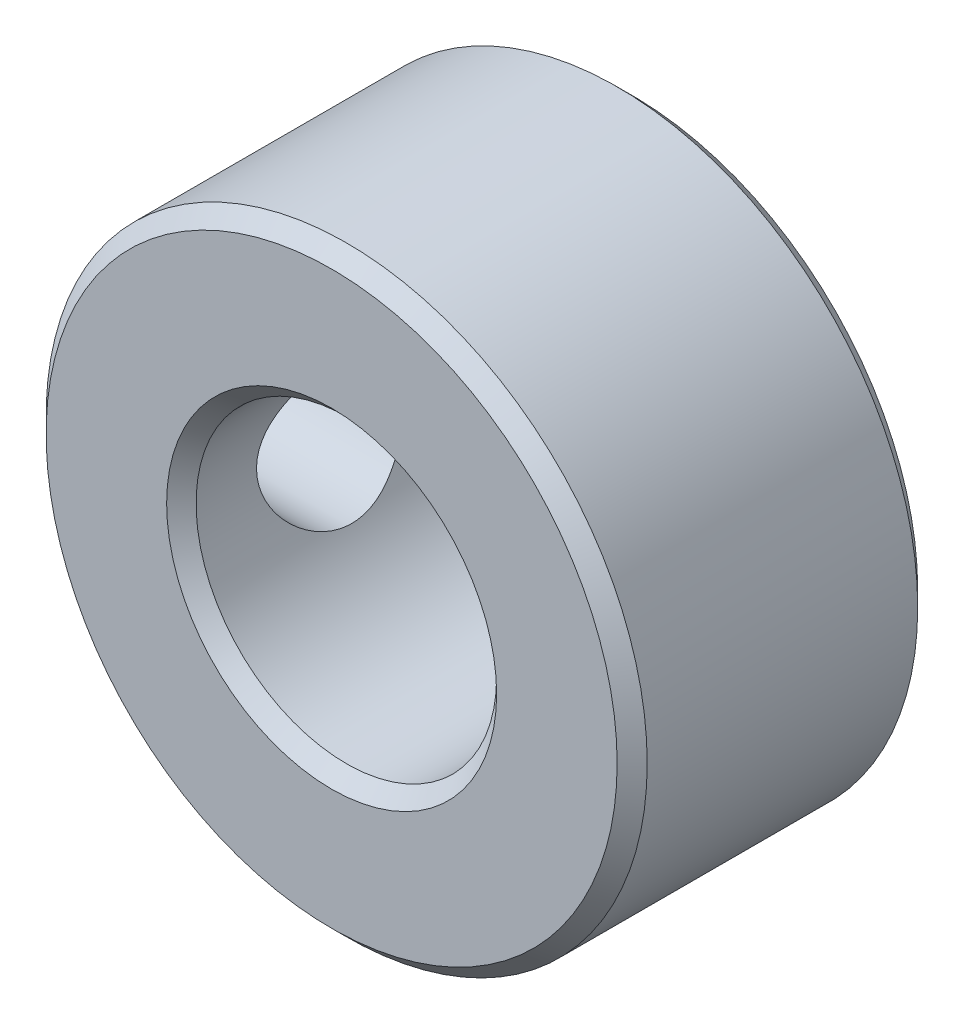
ISO-10303-21;
HEADER;
FILE_DESCRIPTION(('STEP AP214'),'2;1');
FILE_NAME('part.step','',(''),(''),'','','');
FILE_SCHEMA(('AUTOMOTIVE_DESIGN { 1 0 10303 214 1 1 1 1 }'));
ENDSEC;
DATA;
#1=APPLICATION_CONTEXT('core data for automotive mechanical design processes');
#2=APPLICATION_PROTOCOL_DEFINITION('international standard','automotive_design',2000,#1);
#3=PRODUCT_CONTEXT('',#1,'mechanical');
#4=PRODUCT('Part','Part','',(#3));
#5=PRODUCT_RELATED_PRODUCT_CATEGORY('part','',(#4));
#6=PRODUCT_DEFINITION_FORMATION('','',#4);
#7=PRODUCT_DEFINITION_CONTEXT('part definition',#1,'design');
#8=PRODUCT_DEFINITION('design','',#6,#7);
#9=PRODUCT_DEFINITION_SHAPE('','',#8);
#10=(LENGTH_UNIT() NAMED_UNIT(*) SI_UNIT(.MILLI.,.METRE.));
#11=(NAMED_UNIT(*) PLANE_ANGLE_UNIT() SI_UNIT($,.RADIAN.));
#12=(NAMED_UNIT(*) SI_UNIT($,.STERADIAN.) SOLID_ANGLE_UNIT());
#13=UNCERTAINTY_MEASURE_WITH_UNIT(LENGTH_MEASURE(1.E-05),#10,'distance_accuracy_value','');
#14=(GEOMETRIC_REPRESENTATION_CONTEXT(3) GLOBAL_UNCERTAINTY_ASSIGNED_CONTEXT((#13)) GLOBAL_UNIT_ASSIGNED_CONTEXT((#10,
#11,#12)) REPRESENTATION_CONTEXT('',''));
#15=CARTESIAN_POINT('',(0.,0.,0.));
#16=DIRECTION('',(0.,0.,1.));
#17=DIRECTION('',(1.,0.,0.));
#18=AXIS2_PLACEMENT_3D('',#15,#16,#17);
#19=CARTESIAN_POINT('',(33.2499999916199,61.2600000000035,-9.8775));
#20=DIRECTION('',(0.,0.,-1.));
#21=DIRECTION('',(-1.,0.,0.));
#22=AXIS2_PLACEMENT_3D('',#19,#20,#21);
#23=CONICAL_SURFACE('',#22,2.6225,0.785398163397484);
#24=CARTESIAN_POINT('',(33.2499999916199,61.2600000000035,-9.755));
#25=DIRECTION('',(0.,0.,1.));
#26=DIRECTION('',(-1.,0.,0.));
#27=AXIS2_PLACEMENT_3D('',#24,#25,#26);
#28=CIRCLE('',#27,2.5);
#29=CARTESIAN_POINT('',(35.7499999916199,61.2600000000035,-9.755));
#30=VERTEX_POINT('',#29);
#31=EDGE_CURVE('E29',#30,#30,#28,.T.);
#32=ORIENTED_EDGE('',*,*,#31,.T.);
#33=DIRECTION('',(0.707106781186573,0.,-0.707106781186522));
#34=VECTOR('',#33,1.);
#35=CARTESIAN_POINT('',(35.8724999916199,61.2600000000035,-9.8775));
#36=LINE('',#35,#34);
#37=CARTESIAN_POINT('',(35.9949999916199,61.2600000000035,-10.));
#38=VERTEX_POINT('',#37);
#39=EDGE_CURVE('E11',#30,#38,#36,.T.);
#40=ORIENTED_EDGE('',*,*,#39,.T.);
#41=CARTESIAN_POINT('',(33.2499999916199,61.2600000000035,-10.));
#42=DIRECTION('',(0.,0.,-1.));
#43=DIRECTION('',(-1.,0.,0.));
#44=AXIS2_PLACEMENT_3D('',#41,#42,#43);
#45=CIRCLE('',#44,2.745);
#46=EDGE_CURVE('E105',#38,#38,#45,.T.);
#47=ORIENTED_EDGE('',*,*,#46,.T.);
#48=ORIENTED_EDGE('',*,*,#39,.F.);
#49=EDGE_LOOP('',(#32,#40,#47,#48));
#50=FACE_BOUND('',#49,.T.);
#51=ADVANCED_FACE('F17',(#50),#23,.F.);
#52=CARTESIAN_POINT('',(33.2499999916199,61.2600000000035,-10.));
#53=DIRECTION('',(0.,0.,1.));
#54=DIRECTION('',(-1.,0.,0.));
#55=AXIS2_PLACEMENT_3D('',#52,#53,#54);
#56=CYLINDRICAL_SURFACE('',#55,2.5);
#57=CARTESIAN_POINT('',(30.7499999916199,61.2600000000035,-8.75));
#58=CARTESIAN_POINT('',(30.750003574068,61.1942850463123,-8.74999587210066));
#59=CARTESIAN_POINT('',(30.7526188538759,61.128491750381,-8.74478740859791));
#60=CARTESIAN_POINT('',(30.7628230411524,60.998849705918,-8.72418389957383));
#61=CARTESIAN_POINT('',(30.7704213937576,60.9350048916117,-8.70876950875293));
#62=CARTESIAN_POINT('',(30.7897964990785,60.8113330689028,-8.66850773922904));
#63=CARTESIAN_POINT('',(30.8015570019009,60.7514914963295,-8.64369701969004));
#64=CARTESIAN_POINT('',(30.8281777851727,60.6369092289953,-8.5855367232939));
#65=CARTESIAN_POINT('',(30.8430378212008,60.5821681325159,-8.55218781968902));
#66=CARTESIAN_POINT('',(30.8755467633942,60.4756152278011,-8.47560343814347));
#67=CARTESIAN_POINT('',(30.8933100025257,60.4241809861008,-8.43189190095056));
#68=CARTESIAN_POINT('',(30.9292503635356,60.3290256939197,-8.33684815094134));
#69=CARTESIAN_POINT('',(30.947427789007,60.28531052112,-8.2855101852846));
#70=CARTESIAN_POINT('',(30.9837631016531,60.2034349994405,-8.17189581309593));
#71=CARTESIAN_POINT('',(31.0018101544933,60.1659683305638,-8.10907987706777));
#72=CARTESIAN_POINT('',(31.033925256966,60.10228971639,-7.97704083001741));
#73=CARTESIAN_POINT('',(31.0479961465326,60.0760697312954,-7.90782233909675));
#74=CARTESIAN_POINT('',(31.0692766536474,60.0373344472676,-7.76916861822279));
#75=CARTESIAN_POINT('',(31.0768465968236,60.0240926786528,-7.69999443491595));
#76=CARTESIAN_POINT('',(31.0852263672634,60.0094662583672,-7.56002645277584));
#77=CARTESIAN_POINT('',(31.0860428748289,60.0080698895369,-7.48923432391123));
#78=CARTESIAN_POINT('',(31.0811133634044,60.0166408910378,-7.35714246960596));
#79=CARTESIAN_POINT('',(31.0761404458449,60.0252693005822,-7.29571996097136));
#80=CARTESIAN_POINT('',(31.0615471324469,60.0513251886821,-7.17534761328386));
#81=CARTESIAN_POINT('',(31.0519252562228,60.0687554701312,-7.11639856836852));
#82=CARTESIAN_POINT('',(31.0289065364608,60.1122377745207,-7.00096358429308));
#83=CARTESIAN_POINT('',(31.0154269833201,60.1384811661082,-6.94456700151791));
#84=CARTESIAN_POINT('',(30.9862074381025,60.1986978904182,-6.83670713426264));
#85=CARTESIAN_POINT('',(30.9704664318677,60.2326746952376,-6.78524608050005));
#86=CARTESIAN_POINT('',(30.936085517829,60.3124174313622,-6.68184843407112));
#87=CARTESIAN_POINT('',(30.9173311136607,60.3591319270415,-6.63067890802994));
#88=CARTESIAN_POINT('',(30.8806547003649,60.4605555265764,-6.53658072676149));
#89=CARTESIAN_POINT('',(30.862733092135,60.5152684292852,-6.49365600995776));
#90=CARTESIAN_POINT('',(30.828725150583,60.6343543677132,-6.41539292371293));
#91=CARTESIAN_POINT('',(30.8127626895949,60.6990580105038,-6.38049940944289));
#92=CARTESIAN_POINT('',(30.7855264776045,60.834417230642,-6.32237871369628));
#93=CARTESIAN_POINT('',(30.7742490048256,60.9050680296715,-6.29914226873107));
#94=CARTESIAN_POINT('',(30.758445819852,61.0440418854272,-6.26690574535416));
#95=CARTESIAN_POINT('',(30.7534382628535,61.1120730868176,-6.25688595531651));
#96=CARTESIAN_POINT('',(30.7490873233811,61.2490255000664,-6.24816908608184));
#97=CARTESIAN_POINT('',(30.7497412576035,61.3179462748404,-6.24946664295059));
#98=CARTESIAN_POINT('',(30.7563600884519,61.4490412149855,-6.26275836052336));
#99=CARTESIAN_POINT('',(30.7619094205175,61.5113242600655,-6.27391566591244));
#100=CARTESIAN_POINT('',(30.7772228501846,61.6330086153804,-6.30529758986874));
#101=CARTESIAN_POINT('',(30.7869874124406,61.6924096071168,-6.32552320806658));
#102=CARTESIAN_POINT('',(30.8101968489489,61.8086107605651,-6.37499808304133));
#103=CARTESIAN_POINT('',(30.8237389694956,61.8652879962608,-6.40448881264587));
#104=CARTESIAN_POINT('',(30.8532003126559,61.9730767021268,-6.47138441955738));
#105=CARTESIAN_POINT('',(30.8691205470475,62.0241857872222,-6.5087926682416));
#106=CARTESIAN_POINT('',(30.9036472249015,62.1247096116165,-6.59470053166587));
#107=CARTESIAN_POINT('',(30.9223639310142,62.1734650972839,-6.64392858556673));
#108=CARTESIAN_POINT('',(30.9592200965713,62.2623204013947,-6.74990643908639));
#109=CARTESIAN_POINT('',(30.9773591493506,62.3024142321167,-6.80666139852021));
#110=CARTESIAN_POINT('',(31.0118600887939,62.3746348931252,-6.92955456775011));
#111=CARTESIAN_POINT('',(31.0280933708263,62.4062818698515,-6.99601408276045));
#112=CARTESIAN_POINT('',(31.0553240870182,62.4576035325205,-7.13438758461534));
#113=CARTESIAN_POINT('',(31.066328263612,62.4772936448627,-7.20629440812617));
#114=CARTESIAN_POINT('',(31.0804812290114,62.5023271093154,-7.3461377785765));
#115=CARTESIAN_POINT('',(31.0842826983636,62.5088662455043,-7.41379281678599));
#116=CARTESIAN_POINT('',(31.0854330585426,62.5108614429793,-7.54930883396312));
#117=CARTESIAN_POINT('',(31.0827847462754,62.5063223082838,-7.61716971092401));
#118=CARTESIAN_POINT('',(31.0720267159945,62.4874076569937,-7.74435437691475));
#119=CARTESIAN_POINT('',(31.0644613105899,62.4740103929318,-7.80387558768024));
#120=CARTESIAN_POINT('',(31.0453622892709,62.4389691977842,-7.91976014928064));
#121=CARTESIAN_POINT('',(31.0338273969989,62.4173226139531,-7.97612247761473));
#122=CARTESIAN_POINT('',(31.0071433620632,62.3647696816292,-8.08828106373303));
#123=CARTESIAN_POINT('',(30.9918034616675,62.3333389222739,-8.1437848772869));
#124=CARTESIAN_POINT('',(30.9595583461875,62.2626887145492,-8.24909317022552));
#125=CARTESIAN_POINT('',(30.9426523191883,62.2234652140518,-8.29889466314792));
#126=CARTESIAN_POINT('',(30.9067209521285,62.1327541583343,-8.39767747794684));
#127=CARTESIAN_POINT('',(30.8876877002265,62.0803555287662,-8.44582387795221));
#128=CARTESIAN_POINT('',(30.8515280884313,61.9676935077788,-8.53282872927936));
#129=CARTESIAN_POINT('',(30.8344027590194,61.9074259040744,-8.57168217428269));
#130=CARTESIAN_POINT('',(30.8037748718061,61.7799144960284,-8.63904545345261));
#131=CARTESIAN_POINT('',(30.7902987845835,61.7126243799217,-8.66748021176416));
#132=CARTESIAN_POINT('',(30.7687332245766,61.5734276266212,-8.7122602098986));
#133=CARTESIAN_POINT('',(30.7606284494583,61.5015347495324,-8.72863980853689));
#134=CARTESIAN_POINT('',(30.7538067177491,61.4007524331077,-8.74237176384474));
#135=CARTESIAN_POINT('',(30.7523829248799,61.3727023493029,-8.74522830107944));
#136=CARTESIAN_POINT('',(30.7504787793966,61.3164396647624,-8.74904333189596));
#137=CARTESIAN_POINT('',(30.7499984528229,61.2882270595627,-8.75000177308898));
#138=CARTESIAN_POINT('',(30.7499999916199,61.2600000000035,-8.75));
#139=B_SPLINE_CURVE_WITH_KNOTS('',3,(#57,#58,#59,#60,#61,#62,#63,#64,#65,#66,#67,#68,#69,#70,
#71,#72,#73,#74,#75,#76,#77,#78,#79,#80,#81,#82,#83,#84,#85,#86,#87,#88,#89,#90,#91,#92,#93,#94,
#95,#96,#97,#98,#99,#100,#101,#102,#103,#104,#105,#106,#107,#108,#109,#110,#111,#112,#113,#114,
#115,#116,#117,#118,#119,#120,#121,#122,#123,#124,#125,#126,#127,#128,#129,#130,#131,#132,#133,
#134,#135,#136,#137,#138),.UNSPECIFIED.,.T.,.F.,(4,2,2,2,2,2,2,2,2,2,2,2,2,2,2,2,2,2,2,2,2,2,2,
2,2,2,2,2,2,2,2,2,2,2,2,2,2,2,2,2,4),(0.,0.19703032177534,0.394435187136452,0.591077694365336,
0.787704700726923,0.996227198397589,1.20490779706754,1.4297715803844,1.6544743487285,
1.86572515175288,2.07676696661278,2.26257140511653,2.44843504907101,2.63862800210611,
2.82890651575278,3.04331176667347,3.25781918248356,3.48228777768051,3.70657771140351,
3.91229113089185,4.11790705639349,4.30758633132653,4.49728652038665,4.69241070034876,
4.88761813435429,5.10199513305523,5.31651985769285,5.54143352699589,5.76605639925968,
5.96911634372965,6.17208824825007,6.35572412805231,6.53941910979602,6.7354557096952,
6.93159451423697,7.15156553440623,7.37165479220716,7.59330017078657,7.81431135781165,
7.89894100172123,7.98357298143559),.UNSPECIFIED.);
#140=CARTESIAN_POINT('',(31.0849364821587,62.5100000000033,-7.5));
#141=VERTEX_POINT('',#140);
#142=EDGE_CURVE('E128',#141,#141,#139,.T.);
#143=ORIENTED_EDGE('',*,*,#142,.T.);
#144=EDGE_LOOP('',(#143));
#145=FACE_BOUND('',#144,.T.);
#146=CARTESIAN_POINT('',(33.2499999916199,61.2600000000035,-5.24499999999994));
#147=DIRECTION('',(0.,0.,-1.));
#148=DIRECTION('',(-1.,0.,0.));
#149=AXIS2_PLACEMENT_3D('',#146,#147,#148);
#150=CIRCLE('',#149,2.5);
#151=CARTESIAN_POINT('',(35.7499999916199,61.2600000000035,-5.24499999999994));
#152=VERTEX_POINT('',#151);
#153=EDGE_CURVE('E141',#152,#152,#150,.T.);
#154=ORIENTED_EDGE('',*,*,#153,.F.);
#155=DIRECTION('',(0.,0.,-1.));
#156=VECTOR('',#155,1.);
#157=CARTESIAN_POINT('',(35.7499999916199,61.2600000000035,-10.));
#158=LINE('',#157,#156);
#159=EDGE_CURVE('E137',#152,#30,#158,.T.);
#160=ORIENTED_EDGE('',*,*,#159,.T.);
#161=ORIENTED_EDGE('',*,*,#31,.F.);
#162=ORIENTED_EDGE('',*,*,#159,.F.);
#163=EDGE_LOOP('',(#154,#160,#161,#162));
#164=FACE_BOUND('',#163,.T.);
#165=ADVANCED_FACE('F154',(#145,#164),#56,.F.);
#166=CARTESIAN_POINT('',(33.2499999916199,61.2600000000035,-5.12249999999994));
#167=DIRECTION('',(0.,0.,1.));
#168=DIRECTION('',(-1.,0.,0.));
#169=AXIS2_PLACEMENT_3D('',#166,#167,#168);
#170=CONICAL_SURFACE('',#169,2.6225,0.785398163397419);
#171=ORIENTED_EDGE('',*,*,#153,.T.);
#172=DIRECTION('',(0.707106781186527,0.,0.707106781186568));
#173=VECTOR('',#172,1.);
#174=CARTESIAN_POINT('',(35.8724999916199,61.2600000000035,-5.12249999999994));
#175=LINE('',#174,#173);
#176=CARTESIAN_POINT('',(35.9949999916199,61.2600000000035,-4.99999999999994));
#177=VERTEX_POINT('',#176);
#178=EDGE_CURVE('E53',#152,#177,#175,.T.);
#179=ORIENTED_EDGE('',*,*,#178,.T.);
#180=CARTESIAN_POINT('',(33.2499999916199,61.2600000000035,-4.99999999999994));
#181=DIRECTION('',(0.,0.,1.));
#182=DIRECTION('',(-1.,0.,0.));
#183=AXIS2_PLACEMENT_3D('',#180,#181,#182);
#184=CIRCLE('',#183,2.745);
#185=EDGE_CURVE('E135',#177,#177,#184,.T.);
#186=ORIENTED_EDGE('',*,*,#185,.T.);
#187=ORIENTED_EDGE('',*,*,#178,.F.);
#188=EDGE_LOOP('',(#171,#179,#186,#187));
#189=FACE_BOUND('',#188,.T.);
#190=ADVANCED_FACE('F225',(#189),#170,.F.);
#191=CARTESIAN_POINT('',(40.0998250928018,79.6300000000035,-5.));
#192=DIRECTION('',(0.,0.,1.));
#193=DIRECTION('',(0.,-1.,0.));
#194=AXIS2_PLACEMENT_3D('',#191,#192,#193);
#195=PLANE('',#194);
#196=ORIENTED_EDGE('',*,*,#185,.F.);
#197=EDGE_LOOP('',(#196));
#198=FACE_BOUND('',#197,.T.);
#199=CARTESIAN_POINT('',(33.2499999916199,61.2600000000035,-4.99999999999994));
#200=DIRECTION('',(0.,0.,-1.));
#201=DIRECTION('',(-1.,0.,0.));
#202=AXIS2_PLACEMENT_3D('',#199,#200,#201);
#203=CIRCLE('',#202,4.75);
#204=CARTESIAN_POINT('',(37.9999999916199,61.2600000000035,-4.99999999999994));
#205=VERTEX_POINT('',#204);
#206=EDGE_CURVE('E62',#205,#205,#203,.T.);
#207=ORIENTED_EDGE('',*,*,#206,.F.);
#208=EDGE_LOOP('',(#207));
#209=FACE_BOUND('',#208,.T.);
#210=ADVANCED_FACE('F227',(#198,#209),#195,.T.);
#211=CARTESIAN_POINT('',(33.2499999916199,61.2600000000035,-5.125));
#212=DIRECTION('',(0.,0.,-1.));
#213=DIRECTION('',(-1.,0.,0.));
#214=AXIS2_PLACEMENT_3D('',#211,#212,#213);
#215=CONICAL_SURFACE('',#214,4.875,0.785398163397411);
#216=CARTESIAN_POINT('',(33.2499999916199,61.2600000000035,-5.25));
#217=DIRECTION('',(0.,0.,1.));
#218=DIRECTION('',(-1.,0.,0.));
#219=AXIS2_PLACEMENT_3D('',#216,#217,#218);
#220=CIRCLE('',#219,5.);
#221=CARTESIAN_POINT('',(38.2499999916199,61.2600000000035,-5.25));
#222=VERTEX_POINT('',#221);
#223=EDGE_CURVE('E103',#222,#222,#220,.T.);
#224=ORIENTED_EDGE('',*,*,#223,.T.);
#225=DIRECTION('',(-0.707106781186521,0.,0.707106781186574));
#226=VECTOR('',#225,1.);
#227=CARTESIAN_POINT('',(38.1249999916199,61.2600000000035,-5.125));
#228=LINE('',#227,#226);
#229=EDGE_CURVE('E130',#222,#205,#228,.T.);
#230=ORIENTED_EDGE('',*,*,#229,.T.);
#231=ORIENTED_EDGE('',*,*,#206,.T.);
#232=ORIENTED_EDGE('',*,*,#229,.F.);
#233=EDGE_LOOP('',(#224,#230,#231,#232));
#234=FACE_BOUND('',#233,.T.);
#235=ADVANCED_FACE('F230',(#234),#215,.T.);
#236=CARTESIAN_POINT('',(40.0998250928018,79.6300000000035,-10.));
#237=DIRECTION('',(0.,0.,1.));
#238=DIRECTION('',(0.,-1.,0.));
#239=AXIS2_PLACEMENT_3D('',#236,#237,#238);
#240=PLANE('',#239);
#241=ORIENTED_EDGE('',*,*,#46,.F.);
#242=EDGE_LOOP('',(#241));
#243=FACE_BOUND('',#242,.T.);
#244=CARTESIAN_POINT('',(33.2499999916199,61.2600000000035,-10.));
#245=DIRECTION('',(0.,0.,1.));
#246=DIRECTION('',(-1.,0.,0.));
#247=AXIS2_PLACEMENT_3D('',#244,#245,#246);
#248=CIRCLE('',#247,4.75);
#249=CARTESIAN_POINT('',(37.9999999916199,61.2600000000035,-10.));
#250=VERTEX_POINT('',#249);
#251=EDGE_CURVE('E119',#250,#250,#248,.T.);
#252=ORIENTED_EDGE('',*,*,#251,.F.);
#253=EDGE_LOOP('',(#252));
#254=FACE_BOUND('',#253,.T.);
#255=ADVANCED_FACE('F169',(#243,#254),#240,.F.);
#256=CARTESIAN_POINT('',(33.2499999916199,61.2600000000035,-10.));
#257=DIRECTION('',(0.,0.,1.));
#258=DIRECTION('',(-1.,0.,0.));
#259=AXIS2_PLACEMENT_3D('',#256,#257,#258);
#260=CYLINDRICAL_SURFACE('',#259,5.);
#261=CARTESIAN_POINT('',(28.4372474365716,59.9044879772329,-7.49999999999995));
#262=CARTESIAN_POINT('',(28.4372460969126,59.9044939501337,-7.52552764556176));
#263=CARTESIAN_POINT('',(28.4371103853482,59.9049746301144,-7.55105592293867));
#264=CARTESIAN_POINT('',(28.4365698640669,59.9068953192905,-7.6019112406172));
#265=CARTESIAN_POINT('',(28.4361667662633,59.9083292256775,-7.62723853046742));
#266=CARTESIAN_POINT('',(28.4350937391105,59.9121567310729,-7.67769207469152));
#267=CARTESIAN_POINT('',(28.4344251073822,59.9145456633978,-7.70281870930217));
#268=CARTESIAN_POINT('',(28.4328258806578,59.920282685637,-7.7528707026705));
#269=CARTESIAN_POINT('',(28.4318961486175,59.9236276165395,-7.7777964508105));
#270=CARTESIAN_POINT('',(28.4297811079334,59.931276697325,-7.8274467575389));
#271=CARTESIAN_POINT('',(28.4285962293341,59.9355792335879,-7.85217158288945));
#272=CARTESIAN_POINT('',(28.4259788979375,59.9451444739722,-7.90142002189345));
#273=CARTESIAN_POINT('',(28.4245464598302,59.9504071211226,-7.92594364739549));
#274=CARTESIAN_POINT('',(28.4214442404424,59.9618918291932,-7.97479056420655));
#275=CARTESIAN_POINT('',(28.4197740930888,59.9681153711723,-7.99911348414098));
#276=CARTESIAN_POINT('',(28.4162063000167,59.9815295247127,-8.04755716466081));
#277=CARTESIAN_POINT('',(28.4143079518847,59.9887231309064,-8.07167704322212));
#278=CARTESIAN_POINT('',(28.4102747362915,60.0041638537009,-8.12006313377842));
#279=CARTESIAN_POINT('',(28.4081360755848,60.0124283174243,-8.14432349031982));
#280=CARTESIAN_POINT('',(28.4036935527497,60.0297994604868,-8.1922006052162));
#281=CARTESIAN_POINT('',(28.4013919309492,60.0388950838172,-8.21582157774048));
#282=CARTESIAN_POINT('',(28.3966362523097,60.0579369064274,-8.26241754264025));
#283=CARTESIAN_POINT('',(28.3941840050385,60.0678734041915,-8.28539667890604));
#284=CARTESIAN_POINT('',(28.3891432565376,60.0885971949531,-8.33070969219227));
#285=CARTESIAN_POINT('',(28.3865561232053,60.0993763518052,-8.35304743938621));
#286=CARTESIAN_POINT('',(28.3812625536509,60.1217876326611,-8.39707794191219));
#287=CARTESIAN_POINT('',(28.3785570789496,60.1334132600972,-8.41877411684944));
#288=CARTESIAN_POINT('',(28.3730450634647,60.1575197732698,-8.46152155353796));
#289=CARTESIAN_POINT('',(28.3702391260205,60.169995862263,-8.48257559719029));
#290=CARTESIAN_POINT('',(28.3645461764709,60.1958030699673,-8.52404113786955));
#291=CARTESIAN_POINT('',(28.36165947386,60.2091311241827,-8.5444545831631));
#292=CARTESIAN_POINT('',(28.3558243077355,60.2366517305364,-8.5846335045167));
#293=CARTESIAN_POINT('',(28.3528759469463,60.2508429099185,-8.60439993637881));
#294=CARTESIAN_POINT('',(28.3467418889886,60.2810648251617,-8.64464362165195));
#295=CARTESIAN_POINT('',(28.3435538409644,60.2971549344205,-8.6650759541198));
#296=CARTESIAN_POINT('',(28.3372308360023,60.3299607921933,-8.70476924359768));
#297=CARTESIAN_POINT('',(28.3340960482219,60.3466583605461,-8.72404523146468));
#298=CARTESIAN_POINT('',(28.3278965064378,60.380687201783,-8.7614192881403));
#299=CARTESIAN_POINT('',(28.3248314887512,60.3980022136952,-8.77953209096382));
#300=CARTESIAN_POINT('',(28.318791139548,60.4332629003679,-8.81458204334288));
#301=CARTESIAN_POINT('',(28.3158151541178,60.4511946730117,-8.83153304649404));
#302=CARTESIAN_POINT('',(28.3099725564704,60.4876879828428,-8.86425994891307));
#303=CARTESIAN_POINT('',(28.3071050199161,60.5062381131749,-8.88004838589154));
#304=CARTESIAN_POINT('',(28.3014996689223,60.5439662639341,-8.91045165127242));
#305=CARTESIAN_POINT('',(28.2987607969806,60.5631354753553,-8.9250772025442));
#306=CARTESIAN_POINT('',(28.2934336882963,60.6020987739489,-8.95315693626446));
#307=CARTESIAN_POINT('',(28.290844423395,60.6218866495358,-8.96661953928204));
#308=CARTESIAN_POINT('',(28.2858376103707,60.6620871021448,-8.99237467250302));
#309=CARTESIAN_POINT('',(28.2834192451153,60.6824959287604,-9.00467288193581));
#310=CARTESIAN_POINT('',(28.2798578291671,60.7142798015678,-9.0226504288207));
#311=CARTESIAN_POINT('',(28.2786469893164,60.7254189727206,-9.02873687416163));
#312=CARTESIAN_POINT('',(28.2762953459517,60.7477628038285,-9.04051466556841));
#313=CARTESIAN_POINT('',(28.275153944558,60.7589655747961,-9.04620946514792));
#314=CARTESIAN_POINT('',(28.2729423404587,60.7814361436897,-9.0572028285958));
#315=CARTESIAN_POINT('',(28.2718715577652,60.7927022753851,-9.0625046812293));
#316=CARTESIAN_POINT('',(28.2698023550867,60.8152988836265,-9.07271268003344));
#317=CARTESIAN_POINT('',(28.2688033808698,60.8266279197139,-9.07762189988797));
#318=CARTESIAN_POINT('',(28.2668789530404,60.8493496922396,-9.08704476618876));
#319=CARTESIAN_POINT('',(28.2659529791755,60.8607412108796,-9.09156124111546));
#320=CARTESIAN_POINT('',(28.2641757053272,60.8835872780172,-9.10019889834176));
#321=CARTESIAN_POINT('',(28.2633239274176,60.8950408250225,-9.10432262951277));
#322=CARTESIAN_POINT('',(28.2616961933775,60.9180102739129,-9.11217508316724));
#323=CARTESIAN_POINT('',(28.2609198099706,60.929525380145,-9.11590604310139));
#324=CARTESIAN_POINT('',(28.2594440075018,60.9526172671933,-9.12297327769901));
#325=CARTESIAN_POINT('',(28.2587442199272,60.9641934438094,-9.12631144852712));
#326=CARTESIAN_POINT('',(28.2574227464199,60.9874067910659,-9.13259345524608));
#327=CARTESIAN_POINT('',(28.2568007584538,60.9990435307655,-9.13553881924068));
#328=CARTESIAN_POINT('',(28.2556360164873,61.0223773266384,-9.14103558892778));
#329=CARTESIAN_POINT('',(28.2550930340603,61.03407410344,-9.14358813165979));
#330=CARTESIAN_POINT('',(28.2540874309928,61.0575273023722,-9.14829965696105));
#331=CARTESIAN_POINT('',(28.2536246618915,61.0692835719538,-9.15045936696932));
#332=CARTESIAN_POINT('',(28.252780609439,61.0928550943159,-9.15438564214899));
#333=CARTESIAN_POINT('',(28.2523992630205,61.1046702941381,-9.15615251164544));
#334=CARTESIAN_POINT('',(28.2517191768407,61.1283590266063,-9.15929353237551));
#335=CARTESIAN_POINT('',(28.2514204637664,61.14023257684,-9.1606675567414));
#336=CARTESIAN_POINT('',(28.2509067630352,61.1640373708815,-9.16302332202113));
#337=CARTESIAN_POINT('',(28.25069189501,61.1759686727118,-9.16400450246985));
#338=CARTESIAN_POINT('',(28.2503470020421,61.199888350342,-9.16557500771843));
#339=CARTESIAN_POINT('',(28.2502171916304,61.2118767942218,-9.16616334175855));
#340=CARTESIAN_POINT('',(28.2500435313561,61.2359101265877,-9.16694860480679));
#341=CARTESIAN_POINT('',(28.2499999916183,61.2479550632516,-9.16714412175605));
#342=CARTESIAN_POINT('',(28.2499999916215,61.2720431110041,-9.16714408529874));
#343=CARTESIAN_POINT('',(28.2500435181641,61.2840862220926,-9.16694859116548));
#344=CARTESIAN_POINT('',(28.2502171274852,61.3081161468811,-9.1661633475585));
#345=CARTESIAN_POINT('',(28.2503469019481,61.3201030084974,-9.16557500239829));
#346=CARTESIAN_POINT('',(28.2506917038881,61.3440197658223,-9.16400449191442));
#347=CARTESIAN_POINT('',(28.2509065186156,61.3559497290667,-9.16302330930337));
#348=CARTESIAN_POINT('',(28.2514200990197,61.3797520904988,-9.16066754538295));
#349=CARTESIAN_POINT('',(28.25171874681,61.391624545876,-9.15929351644466));
#350=CARTESIAN_POINT('',(28.2523986940462,61.4153113335271,-9.15615249534918));
#351=CARTESIAN_POINT('',(28.252779968507,61.4271256822696,-9.15438562197812));
#352=CARTESIAN_POINT('',(28.2536238739826,61.4506957476044,-9.15045934696315));
#353=CARTESIAN_POINT('',(28.2540865697162,61.4624514098472,-9.14829963301768));
#354=CARTESIAN_POINT('',(28.2550920282568,61.4859036393836,-9.14358810783523));
#355=CARTESIAN_POINT('',(28.2556349411202,61.4976000524895,-9.14103556137401));
#356=CARTESIAN_POINT('',(28.2567995513921,61.5209333663049,-9.13553879194225));
#357=CARTESIAN_POINT('',(28.2574214787624,61.53256998579,-9.1325934244182));
#358=CARTESIAN_POINT('',(28.258742843686,61.5557833378912,-9.12631141805773));
#359=CARTESIAN_POINT('',(28.2594425847447,61.5673596375415,-9.12297324394682));
#360=CARTESIAN_POINT('',(28.2609183119168,61.5904520157862,-9.11590600986423));
#361=CARTESIAN_POINT('',(28.2616946679513,61.6019674880316,-9.112175046962));
#362=CARTESIAN_POINT('',(28.2633223700437,61.6249379137147,-9.10432259388041));
#363=CARTESIAN_POINT('',(28.2641741447241,61.6363920692778,-9.1001988599377));
#364=CARTESIAN_POINT('',(28.2659514399595,61.6592395981962,-9.09156120374595));
#365=CARTESIAN_POINT('',(28.2668774397279,61.670631967821,-9.08704472680743));
#366=CARTESIAN_POINT('',(28.2688019520396,61.6933556853397,-9.07762186050634));
#367=CARTESIAN_POINT('',(28.269800986067,61.7046858132227,-9.07271263734317));
#368=CARTESIAN_POINT('',(28.2718703464145,61.7272848517,-9.06250464316076));
#369=CARTESIAN_POINT('',(28.2729412281544,61.7385523197456,-9.05720279373178));
#370=CARTESIAN_POINT('',(28.275153071421,61.7610257911664,-9.04620941811756));
#371=CARTESIAN_POINT('',(28.276294614066,61.7722301261981,-9.04051459867989));
#372=CARTESIAN_POINT('',(28.278646592612,61.7945773753085,-9.02873685937233));
#373=CARTESIAN_POINT('',(28.279857627562,61.8057183990948,-9.02265048318512));
#374=CARTESIAN_POINT('',(28.2834186506955,61.8374987665684,-9.00467769032051));
#375=CARTESIAN_POINT('',(28.2858363652253,61.8579023764666,-8.99238432999255));
#376=CARTESIAN_POINT('',(28.2908419324464,61.8980938767929,-8.96663746239181));
#377=CARTESIAN_POINT('',(28.2934306146441,61.9178779555672,-8.95317818238724));
#378=CARTESIAN_POINT('',(28.2987566874539,61.9568352615585,-8.9251038687704));
#379=CARTESIAN_POINT('',(28.3014951163778,61.9760022112435,-8.9104803248389));
#380=CARTESIAN_POINT('',(28.3070997647286,62.0137274065371,-8.88007978966623));
#381=CARTESIAN_POINT('',(28.309967049513,62.0322767732426,-8.86429199029557));
#382=CARTESIAN_POINT('',(28.315809380725,62.0687701228029,-8.83156508387122));
#383=CARTESIAN_POINT('',(28.3187853572938,62.0867026275478,-8.81461336090345));
#384=CARTESIAN_POINT('',(28.3248259795538,62.1219663542413,-8.77956069291855));
#385=CARTESIAN_POINT('',(28.3278912833157,62.1392836039487,-8.76144582448924));
#386=CARTESIAN_POINT('',(28.334091719736,62.1733184144196,-8.72406629521072));
#387=CARTESIAN_POINT('',(28.3372271186489,62.1900196455261,-8.70478683814418));
#388=CARTESIAN_POINT('',(28.3435517675983,62.2228345887929,-8.66508548199211));
#389=CARTESIAN_POINT('',(28.3467408514259,62.2389300627172,-8.64464850338258));
#390=CARTESIAN_POINT('',(28.3528752470421,62.2691536418733,-8.60440632846415));
#391=CARTESIAN_POINT('',(28.3558229280301,62.2833416211503,-8.58464643748131));
#392=CARTESIAN_POINT('',(28.3616568516701,62.3108566501635,-8.54447864807264));
#393=CARTESIAN_POINT('',(28.3645429858698,62.3241822528104,-8.52406974198606));
#394=CARTESIAN_POINT('',(28.3702349995315,62.3499856456002,-8.48261153390946));
#395=CARTESIAN_POINT('',(28.3730405616981,62.3624602953379,-8.46156023535287));
#396=CARTESIAN_POINT('',(28.3785520395454,62.3865649444482,-8.41881648492779));
#397=CARTESIAN_POINT('',(28.381257342011,62.3981900693632,-8.39712120605816));
#398=CARTESIAN_POINT('',(28.3865508057148,62.4206013704183,-8.3530907011797));
#399=CARTESIAN_POINT('',(28.3891379939946,62.4313809724984,-8.33075201481781));
#400=CARTESIAN_POINT('',(28.3941791140469,62.452106685959,-8.28543532622777));
#401=CARTESIAN_POINT('',(28.3966316653854,62.4620445853628,-8.26245341774987));
#402=CARTESIAN_POINT('',(28.4013882130427,62.4810901730105,-8.21585008445909));
#403=CARTESIAN_POINT('',(28.4036903863752,62.4901880859597,-8.19222448418688));
#404=CARTESIAN_POINT('',(28.4081343513592,62.5075650136725,-8.14433637297982));
#405=CARTESIAN_POINT('',(28.4102738899307,62.5158329060532,-8.12006962218492));
#406=CARTESIAN_POINT('',(28.4143079346546,62.5312768031894,-8.07168084569032));
#407=CARTESIAN_POINT('',(28.4162063195378,62.5384705476716,-8.04756480911462));
#408=CARTESIAN_POINT('',(28.4197741425582,62.551884815844,-7.9991276725004));
#409=CARTESIAN_POINT('',(28.4214442746733,62.5581082980188,-7.97480744397695));
#410=CARTESIAN_POINT('',(28.424546486385,62.5695929767146,-7.92596485271312));
#411=CARTESIAN_POINT('',(28.4259789224795,62.5748556155248,-7.90144285164954));
#412=CARTESIAN_POINT('',(28.4285962562033,62.5844208648154,-7.85219658088636));
#413=CARTESIAN_POINT('',(28.429781128727,62.5887233779318,-7.82747229093641));
#414=CARTESIAN_POINT('',(28.4318961690445,62.5963724572927,-7.77782197898974));
#415=CARTESIAN_POINT('',(28.4328258957612,62.5997173685323,-7.752895683393));
#416=CARTESIAN_POINT('',(28.4344251228714,62.6054543921941,-7.70284151563189));
#417=CARTESIAN_POINT('',(28.435093748897,62.6078433038376,-7.67771324895808));
#418=CARTESIAN_POINT('',(28.4361667763986,62.6116708104878,-7.62725536060139));
#419=CARTESIAN_POINT('',(28.4365698687153,62.6131046973198,-7.60192535534506));
#420=CARTESIAN_POINT('',(28.4371103903302,62.6150253875076,-7.5510635217768));
#421=CARTESIAN_POINT('',(28.4372460963375,62.6155060474945,-7.52553144228336));
#422=CARTESIAN_POINT('',(28.4372474365715,62.6155120227739,-7.49999999999995));
#423=B_SPLINE_CURVE_WITH_KNOTS('',3,(#261,#262,#263,#264,#265,#266,#267,#268,#269,#270,#271,
#272,#273,#274,#275,#276,#277,#278,#279,#280,#281,#282,#283,#284,#285,#286,#287,#288,#289,#290,
#291,#292,#293,#294,#295,#296,#297,#298,#299,#300,#301,#302,#303,#304,#305,#306,#307,#308,#309,
#310,#311,#312,#313,#314,#315,#316,#317,#318,#319,#320,#321,#322,#323,#324,#325,#326,#327,#328,
#329,#330,#331,#332,#333,#334,#335,#336,#337,#338,#339,#340,#341,#342,#343,#344,#345,#346,#347,
#348,#349,#350,#351,#352,#353,#354,#355,#356,#357,#358,#359,#360,#361,#362,#363,#364,#365,#366,
#367,#368,#369,#370,#371,#372,#373,#374,#375,#376,#377,#378,#379,#380,#381,#382,#383,#384,#385,
#386,#387,#388,#389,#390,#391,#392,#393,#394,#395,#396,#397,#398,#399,#400,#401,#402,#403,#404,
#405,#406,#407,#408,#409,#410,#411,#412,#413,#414,#415,#416,#417,#418,#419,#420,#421,#422),
.UNSPECIFIED.,.F.,.F.,(4,2,2,2,2,2,2,2,2,2,2,2,2,2,2,2,2,2,2,2,2,2,2,2,2,2,2,2,2,2,2,2,2,2,2,2,
2,2,2,2,2,2,2,2,2,2,2,2,2,2,2,2,2,2,2,2,2,2,2,2,2,2,2,2,2,2,2,2,2,2,2,2,2,2,2,2,2,2,2,2,4),(0.,
0.0765792793598277,0.15267293979725,0.228399230682075,0.303878127944824,0.379230789095782,
0.454578980433231,0.530044489685582,0.605748538136243,0.68288391657427,0.759111543238969,
0.834555815552792,0.90934503965527,0.983610916578691,1.0574879460212,1.13111275844767,
1.20462339032782,1.28320113697359,1.36025528727882,1.43595735426401,1.5104881857666,
1.58403726972566,1.65680176409842,1.72898525590399,1.80079627364255,1.83904499939015,
1.87689554069424,1.91438143157903,1.95153719340064,1.98839827504988,2.02500098160061,
2.06138239163363,2.0975802637782,2.13363293333589,2.16957920016995,2.20545820933945,
2.24130932621558,2.27717200801898,2.31308567385205,2.34908957535683,2.3852226701054,
2.42135028786006,2.45734944772431,2.49325911008368,2.52911852703562,2.56496711572548,
2.60084432898876,2.6367895254078,2.67284184091259,2.70904006399766,2.74542251649047,
2.78202694160408,2.81889040074787,2.85604918027373,2.89353870901607,2.931393487162,
2.96964702667569,3.04143701649815,3.11360535208169,3.18636069810194,3.25990672318637,
3.3344406146709,3.41015184185293,3.48722119149493,3.56582007953614,3.63930907192154,
3.71291834367892,3.78678601607094,3.86104876892892,3.93584111646481,4.01129474085677,
4.08753789829504,4.16469490805853,4.24038806000886,4.31584569648305,4.39118911776602,
4.46654017598433,4.54202068648489,4.61775184010066,4.69385363036209,4.77044430888741),.UNSPECIFIED.);
#424=CARTESIAN_POINT('',(28.4372474365715,59.9044879772329,-7.49999999999989));
#425=VERTEX_POINT('',#424);
#426=CARTESIAN_POINT('',(28.4372474365715,62.6155120227739,-7.49999999999991));
#427=VERTEX_POINT('',#426);
#428=EDGE_CURVE('E190',#425,#427,#423,.T.);
#429=ORIENTED_EDGE('',*,*,#428,.T.);
#430=CARTESIAN_POINT('',(28.4372474365715,62.6155120227739,-7.49999999999995));
#431=CARTESIAN_POINT('',(28.4372461350414,62.6155069159636,-7.47968066025527));
#432=CARTESIAN_POINT('',(28.4371596943119,62.6152004733169,-7.45936110210388));
#433=CARTESIAN_POINT('',(28.4368160725733,62.6139798054202,-7.41884249116435));
#434=CARTESIAN_POINT('',(28.4365597393691,62.6130685980625,-7.39864334000042));
#435=CARTESIAN_POINT('',(28.4358772464692,62.6106382521486,-7.35836546259863));
#436=CARTESIAN_POINT('',(28.4354517697265,62.6091215582702,-7.33828657773882));
#437=CARTESIAN_POINT('',(28.4344329500502,62.6054804554484,-7.29824933430789));
#438=CARTESIAN_POINT('',(28.433840117482,62.603357893932,-7.27829079487293));
#439=CARTESIAN_POINT('',(28.4324891433301,62.5985049683213,-7.23849424435611));
#440=CARTESIAN_POINT('',(28.4317313377708,62.5957758394768,-7.21865607132177));
#441=CARTESIAN_POINT('',(28.4300536828641,62.5897095449639,-7.17910023523705));
#442=CARTESIAN_POINT('',(28.4291339972568,62.5863729935811,-7.15938247105177));
#443=CARTESIAN_POINT('',(28.4271365400662,62.5790914975803,-7.12006736731655));
#444=CARTESIAN_POINT('',(28.4260587663034,62.5751465445743,-7.10047002943077));
#445=CARTESIAN_POINT('',(28.4237497186301,62.5666475064637,-7.06139572907069));
#446=CARTESIAN_POINT('',(28.4225182871121,62.5620927955729,-7.04191891206035));
#447=CARTESIAN_POINT('',(28.4199073976116,62.5523741378881,-7.00308527554989));
#448=CARTESIAN_POINT('',(28.4185276414254,62.5472089616137,-6.9837287837904));
#449=CARTESIAN_POINT('',(28.41562547555,62.5362660934699,-6.94513645819603));
#450=CARTESIAN_POINT('',(28.414102643164,62.5304865795784,-6.92590117321202));
#451=CARTESIAN_POINT('',(28.4108959230069,62.518218148031,-6.88721762890407));
#452=CARTESIAN_POINT('',(28.4092092961755,62.5117167447135,-6.86777355677042));
#453=CARTESIAN_POINT('',(28.405725813176,62.4981664638665,-6.8292829716616));
#454=CARTESIAN_POINT('',(28.4039300731985,62.4911229811713,-6.81023446000802));
#455=CARTESIAN_POINT('',(28.4002349711003,62.4764850022831,-6.77253586987347));
#456=CARTESIAN_POINT('',(28.398336545928,62.4688953300938,-6.75388382801032));
#457=CARTESIAN_POINT('',(28.3944440343587,62.4531645080723,-6.71697789027117));
#458=CARTESIAN_POINT('',(28.3924507024893,62.445027546754,-6.69872213052128));
#459=CARTESIAN_POINT('',(28.3883766730586,62.4282008366811,-6.66260871244324));
#460=CARTESIAN_POINT('',(28.3862965574493,62.4195146156883,-6.64474934558119));
#461=CARTESIAN_POINT('',(28.3820578640886,62.4015883075671,-6.60942851197665));
#462=CARTESIAN_POINT('',(28.3798997083448,62.3923510627028,-6.59196555264361));
#463=CARTESIAN_POINT('',(28.3755143466641,62.3733214621114,-6.55743736907336));
#464=CARTESIAN_POINT('',(28.3732874207352,62.3635312498964,-6.54037092823211));
#465=CARTESIAN_POINT('',(28.3687745533093,62.34339485982,-6.50663526884754));
#466=CARTESIAN_POINT('',(28.3664887719285,62.3330501214948,-6.4899651698855));
#467=CARTESIAN_POINT('',(28.3618684812096,62.3118024276441,-6.45702267229935));
#468=CARTESIAN_POINT('',(28.3595340391942,62.3009002164978,-6.44074978410202));
#469=CARTESIAN_POINT('',(28.3548283172898,62.2785405420193,-6.40859822760066));
#470=CARTESIAN_POINT('',(28.3524570415792,62.2670831413579,-6.39271951510596));
#471=CARTESIAN_POINT('',(28.3476721448972,62.2435279141231,-6.36127556442311));
#472=CARTESIAN_POINT('',(28.3452583442924,62.2314261965308,-6.34571326462964));
#473=CARTESIAN_POINT('',(28.3404283967341,62.2067123775696,-6.31514119623295));
#474=CARTESIAN_POINT('',(28.3380123338744,62.1941034085002,-6.30012888379062));
#475=CARTESIAN_POINT('',(28.3331901611409,62.1683785963321,-6.27065303221741));
#476=CARTESIAN_POINT('',(28.3307840510255,62.1552650403727,-6.25618749756681));
#477=CARTESIAN_POINT('',(28.3259934424306,62.128529453933,-6.22780580304903));
#478=CARTESIAN_POINT('',(28.323608902984,62.1149089025014,-6.21388825673345));
#479=CARTESIAN_POINT('',(28.3188738448636,62.0871594535278,-6.18660055846351));
#480=CARTESIAN_POINT('',(28.3165232855281,62.073031248953,-6.17322970987061));
#481=CARTESIAN_POINT('',(28.3129675691894,62.0510562821469,-6.15322192392954));
#482=CARTESIAN_POINT('',(28.311745529898,62.0433927467919,-6.14638583370053));
#483=CARTESIAN_POINT('',(28.3093265782732,62.0279885873686,-6.13293391237543));
#484=CARTESIAN_POINT('',(28.3081295401449,62.020249197421,-6.12631669050832));
#485=CARTESIAN_POINT('',(28.3045919421962,61.9970093869323,-6.10687301116634));
#486=CARTESIAN_POINT('',(28.3022750129268,61.9813030968973,-6.09428658649734));
#487=CARTESIAN_POINT('',(28.2977547482697,61.9495794857418,-6.06999967714679));
#488=CARTESIAN_POINT('',(28.2955502335221,61.9335703068343,-6.05828877258566));
#489=CARTESIAN_POINT('',(28.2912633246561,61.901243348426,-6.03574924493863));
#490=CARTESIAN_POINT('',(28.2891797004741,61.8849324569489,-6.02491099663553));
#491=CARTESIAN_POINT('',(28.2851425866491,61.8519990581012,-6.00412507860372));
#492=CARTESIAN_POINT('',(28.2831878852433,61.8353822147883,-5.99416867247272));
#493=CARTESIAN_POINT('',(28.2793098210235,61.8008835114519,-5.97455904624853));
#494=CARTESIAN_POINT('',(28.2773925556776,61.7829793531811,-5.96494383345849));
#495=CARTESIAN_POINT('',(28.2737412330098,61.7470015993186,-5.94673227709428));
#496=CARTESIAN_POINT('',(28.2720047458965,61.7289352331268,-5.93812215564211));
#497=CARTESIAN_POINT('',(28.2687192500328,61.6926311123279,-5.92192896119027));
#498=CARTESIAN_POINT('',(28.2671679841159,61.6743991666179,-5.91433335088978));
#499=CARTESIAN_POINT('',(28.2642578621313,61.6377685684489,-5.9001652426133));
#500=CARTESIAN_POINT('',(28.2628969987736,61.6193742432888,-5.89358198481808));
#501=CARTESIAN_POINT('',(28.2603723564395,61.5824219172499,-5.88143735437686));
#502=CARTESIAN_POINT('',(28.2592069114805,61.5638668864297,-5.87586730516843));
#503=CARTESIAN_POINT('',(28.2570777607949,61.5265966129533,-5.86574672028754));
#504=CARTESIAN_POINT('',(28.2561128150324,61.5078831485237,-5.86118990492444));
#505=CARTESIAN_POINT('',(28.2543892390525,61.4702992695607,-5.85309333872127));
#506=CARTESIAN_POINT('',(28.253629870917,61.4514296738518,-5.84954994755139));
#507=CARTESIAN_POINT('',(28.2523219733542,61.4135366958743,-5.84347749648523));
#508=CARTESIAN_POINT('',(28.2517732701672,61.3945134536179,-5.84094760056735));
#509=CARTESIAN_POINT('',(28.250891182377,61.3563161115145,-5.83689930681954));
#510=CARTESIAN_POINT('',(28.2505582321979,61.337141785499,-5.83538294958316));
#511=CARTESIAN_POINT('',(28.2501121038203,61.2986451517194,-5.83335877493526));
#512=CARTESIAN_POINT('',(28.2499999916099,61.2793225759761,-5.83285584910489));
#513=CARTESIAN_POINT('',(28.2499999916299,61.2406802628924,-5.83285594383591));
#514=CARTESIAN_POINT('',(28.2501120709199,61.221360525552,-5.83335881661511));
#515=CARTESIAN_POINT('',(28.250558075215,61.1828689371881,-5.83538294083694));
#516=CARTESIAN_POINT('',(28.2508909417048,61.163696819963,-5.83689933344761));
#517=CARTESIAN_POINT('',(28.2517728263864,61.1255032609065,-5.84094764075229));
#518=CARTESIAN_POINT('',(28.2523214173917,61.1064815966235,-5.84347754862618));
#519=CARTESIAN_POINT('',(28.2536290771743,61.0685911382675,-5.8495499957672));
#520=CARTESIAN_POINT('',(28.2543883266327,61.0497224897986,-5.85309340439108));
#521=CARTESIAN_POINT('',(28.2561116738473,61.0121398678425,-5.86118997096569));
#522=CARTESIAN_POINT('',(28.2570765160618,60.9934267204104,-5.86574680124368));
#523=CARTESIAN_POINT('',(28.2592054900927,60.95615644195,-5.87586738352888));
#524=CARTESIAN_POINT('',(28.260370868066,60.9376010976112,-5.88143744506603));
#525=CARTESIAN_POINT('',(28.2628954278851,60.9006475094095,-5.89358207605916));
#526=CARTESIAN_POINT('',(28.2642562814044,60.8822522448263,-5.9001653491586));
#527=CARTESIAN_POINT('',(28.2671664577354,60.845619120551,-5.91433344287293));
#528=CARTESIAN_POINT('',(28.268717793146,60.8273855973735,-5.92192904683816));
#529=CARTESIAN_POINT('',(28.2720035168789,60.7910777277061,-5.93812227919695));
#530=CARTESIAN_POINT('',(28.2737401672509,60.7730091996444,-5.94673246625225));
#531=CARTESIAN_POINT('',(28.2773919475504,60.737026336653,-5.96494385571087));
#532=CARTESIAN_POINT('',(28.2793095122501,60.7191192365342,-5.97455884806915));
#533=CARTESIAN_POINT('',(28.2831869634431,60.6846259843011,-5.9941627119699));
#534=CARTESIAN_POINT('',(28.2851406726325,60.6680172274137,-6.00411304568042));
#535=CARTESIAN_POINT('',(28.2891761368451,60.635095935043,-6.0248898541954));
#536=CARTESIAN_POINT('',(28.2912591294986,60.6187891968669,-6.03572527199478));
#537=CARTESIAN_POINT('',(28.2955452568819,60.5864663008778,-6.0582618612687));
#538=CARTESIAN_POINT('',(28.2977496448938,60.5704571646947,-6.06997284447446));
#539=CARTESIAN_POINT('',(28.3022702561305,60.5387294411849,-6.09426271503613));
#540=CARTESIAN_POINT('',(28.3045876791472,60.5230191307865,-6.10685219445914));
#541=CARTESIAN_POINT('',(28.3081263283219,60.4997716436178,-6.12630142018425));
#542=CARTESIAN_POINT('',(28.3093238817382,60.4920287226344,-6.13292128343155));
#543=CARTESIAN_POINT('',(28.311744073323,60.4766163897002,-6.1463791171453));
#544=CARTESIAN_POINT('',(28.312966839557,60.4689482273036,-6.15321849579427));
#545=CARTESIAN_POINT('',(28.3165221715365,60.4469756353744,-6.17322215963798));
#546=CARTESIAN_POINT('',(28.3188715763586,60.4328541918496,-6.18658536660469));
#547=CARTESIAN_POINT('',(28.3236047855788,60.4051148762116,-6.21386161657987));
#548=CARTESIAN_POINT('',(28.3259886384611,60.3914978349535,-6.22777549493196));
#549=CARTESIAN_POINT('',(28.3307784661131,60.3647656489808,-6.25615343297973));
#550=CARTESIAN_POINT('',(28.3331844856987,60.3516521254376,-6.27061901233583));
#551=CARTESIAN_POINT('',(28.338007131143,60.3259239006571,-6.30009866142729));
#552=CARTESIAN_POINT('',(28.3404237573754,60.3133116313641,-6.31511485296197));
#553=CARTESIAN_POINT('',(28.3452556216614,60.2885874630402,-6.34569816474902));
#554=CARTESIAN_POINT('',(28.34767077261,60.27647884092,-6.36126794626595));
#555=CARTESIAN_POINT('',(28.3524564458179,60.2529197919751,-6.39271421101503));
#556=CARTESIAN_POINT('',(28.3548271685537,60.2414650130601,-6.40858740730227));
#557=CARTESIAN_POINT('',(28.3595318397489,60.2191101377184,-6.44072927049834));
#558=CARTESIAN_POINT('',(28.3618657815293,60.2082101412483,-6.45699800789802));
#559=CARTESIAN_POINT('',(28.3664851980597,60.1869661602431,-6.48993333309679));
#560=CARTESIAN_POINT('',(28.3687706019313,60.1766229589484,-6.50660043604659));
#561=CARTESIAN_POINT('',(28.3732828401107,60.1564890009905,-6.54033128987503));
#562=CARTESIAN_POINT('',(28.3755095098068,60.1466997237502,-6.55739594559483));
#563=CARTESIAN_POINT('',(28.3798945016379,60.1276713336506,-6.5919217317015));
#564=CARTESIAN_POINT('',(28.3820525384609,60.1184344046705,-6.60938410160508));
#565=CARTESIAN_POINT('',(28.3862911472919,60.1005080754962,-6.64470493449757));
#566=CARTESIAN_POINT('',(28.3883712913061,60.0918215579778,-6.66256491129196));
#567=CARTESIAN_POINT('',(28.3924455405103,60.0749936061462,-6.69868072915572));
#568=CARTESIAN_POINT('',(28.3944390572261,60.0668557395787,-6.71693829811535));
#569=CARTESIAN_POINT('',(28.3983321131393,60.0511224500102,-6.75384903244049));
#570=CARTESIAN_POINT('',(28.4002308909327,60.0435312545224,-6.7725040790644));
#571=CARTESIAN_POINT('',(28.4039268689979,60.0288896181435,-6.81020987386315));
#572=CARTESIAN_POINT('',(28.4057231251229,60.0218440393226,-6.82926260098352));
#573=CARTESIAN_POINT('',(28.4092078599603,60.0082887946028,-6.86776275721858));
#574=CARTESIAN_POINT('',(28.4108952156301,60.0017845583161,-6.88721219811163));
#575=CARTESIAN_POINT('',(28.4141026316559,59.9895134644352,-6.92589799793274));
#576=CARTESIAN_POINT('',(28.4156254884272,59.9837338585207,-6.94513008076123));
#577=CARTESIAN_POINT('',(28.4185276735916,59.9727909165713,-6.98371674416972));
#578=CARTESIAN_POINT('',(28.419907420486,59.9676257767237,-7.0030707812934));
#579=CARTESIAN_POINT('',(28.4225183048595,59.9579071386201,-7.04190019679272));
#580=CARTESIAN_POINT('',(28.4237497358062,59.9533524304402,-7.06137525261096));
#581=CARTESIAN_POINT('',(28.4260587848888,59.9448533869066,-7.10044673365451));
#582=CARTESIAN_POINT('',(28.4271365555216,59.9409084460701,-7.12004301812478));
#583=CARTESIAN_POINT('',(28.429134012399,59.9336269512431,-7.15935671472851));
#584=CARTESIAN_POINT('',(28.4300536953861,59.9302904097887,-7.17907412934922));
#585=CARTESIAN_POINT('',(28.4317313504872,59.924224114524,-7.21862996763273));
#586=CARTESIAN_POINT('',(28.4324891531711,59.9214949963416,-7.23846849594363));
#587=CARTESIAN_POINT('',(28.4338401274504,59.9166420702602,-7.27826645870649));
#588=CARTESIAN_POINT('',(28.4344329571591,59.9145195191575,-7.29822605792861));
#589=CARTESIAN_POINT('',(28.4354517770616,59.9108784155175,-7.33826612350706));
#590=CARTESIAN_POINT('',(28.4358772509392,59.909361731946,-7.3583467728213));
#591=CARTESIAN_POINT('',(28.4365597441745,59.9069313848273,-7.39862888208356));
#592=CARTESIAN_POINT('',(28.4368160746212,59.9060201872837,-7.41883050201689));
#593=CARTESIAN_POINT('',(28.4371596967037,59.9047995182228,-7.45935475547613));
#594=CARTESIAN_POINT('',(28.437246134663,59.9044930854987,-7.47967748804749));
#595=CARTESIAN_POINT('',(28.4372474365716,59.9044879772329,-7.49999999999995));
#596=B_SPLINE_CURVE_WITH_KNOTS('',3,(#430,#431,#432,#433,#434,#435,#436,#437,#438,#439,#440,
#441,#442,#443,#444,#445,#446,#447,#448,#449,#450,#451,#452,#453,#454,#455,#456,#457,#458,#459,
#460,#461,#462,#463,#464,#465,#466,#467,#468,#469,#470,#471,#472,#473,#474,#475,#476,#477,#478,
#479,#480,#481,#482,#483,#484,#485,#486,#487,#488,#489,#490,#491,#492,#493,#494,#495,#496,#497,
#498,#499,#500,#501,#502,#503,#504,#505,#506,#507,#508,#509,#510,#511,#512,#513,#514,#515,#516,
#517,#518,#519,#520,#521,#522,#523,#524,#525,#526,#527,#528,#529,#530,#531,#532,#533,#534,#535,
#536,#537,#538,#539,#540,#541,#542,#543,#544,#545,#546,#547,#548,#549,#550,#551,#552,#553,#554,
#555,#556,#557,#558,#559,#560,#561,#562,#563,#564,#565,#566,#567,#568,#569,#570,#571,#572,#573,
#574,#575,#576,#577,#578,#579,#580,#581,#582,#583,#584,#585,#586,#587,#588,#589,#590,#591,#592,
#593,#594,#595),.UNSPECIFIED.,.F.,.F.,(4,2,2,2,2,2,2,2,2,2,2,2,2,2,2,2,2,2,2,2,2,2,2,2,2,2,2,2,
2,2,2,2,2,2,2,2,2,2,2,2,2,2,2,2,2,2,2,2,2,2,2,2,2,2,2,2,2,2,2,2,2,2,2,2,2,2,2,2,2,2,2,2,2,2,2,2,
2,2,2,2,2,2,4),(0.,0.0609560495285209,0.121610181008373,0.182021856296286,0.242251255335696,
0.302359105531885,0.36240650303357,0.422454728470691,0.482565059890603,0.542798585733338,
0.603216020685297,0.664920016914408,0.726074164963411,0.786742296143635,0.846989786500052,
0.90688338945331,0.966491047290269,1.02588168357556,1.08512497923572,1.14429113567984,
1.20345062882757,1.26302047907071,1.32226648476184,1.38126987321164,1.44011287638412,
1.49887839944925,1.52990218416479,1.56065851692626,1.6214185342463,1.68127159849106,
1.74033255291541,1.79872091491002,1.85993571694608,1.92017645844409,1.97958559200824,
2.03831162228257,2.09650828351566,2.15433353224976,2.21194837989211,2.26951560330416,
2.32719838252241,2.38515892159319,2.44311094513558,2.50078711955848,2.55834965178056,
2.61596170861166,2.6737860376256,2.73198360559023,2.79071231037709,2.85012581534951,
2.91037254421392,2.97159486092579,3.02995287949575,3.08899861424444,3.14885167848922,
3.20962691897526,3.24039654819649,3.27143739917499,3.33017222110745,3.38899983972855,
3.44800322817836,3.5072646213921,3.5668651864388,3.62600658620202,3.68515860417093,
3.74439176597858,3.8037763082575,3.86338193259732,3.92327756885091,3.98353115164579,
4.04420941344212,4.10537769685857,4.1670997883038,4.22750812943104,4.28773451635558,
4.34783970635918,4.40788482469515,4.467931180129,4.52804007769132,4.58827263148774,
4.64868958040921,4.70935110948336,4.77031667941236),.UNSPECIFIED.);
#597=EDGE_CURVE('E192',#427,#425,#596,.T.);
#598=ORIENTED_EDGE('',*,*,#597,.T.);
#599=EDGE_LOOP('',(#429,#598));
#600=FACE_BOUND('',#599,.T.);
#601=ORIENTED_EDGE('',*,*,#223,.F.);
#602=DIRECTION('',(0.,0.,-1.));
#603=VECTOR('',#602,1.);
#604=CARTESIAN_POINT('',(38.2499999916199,61.2600000000035,-10.));
#605=LINE('',#604,#603);
#606=CARTESIAN_POINT('',(38.2499999916199,61.2600000000035,-9.75));
#607=VERTEX_POINT('',#606);
#608=EDGE_CURVE('E97',#222,#607,#605,.T.);
#609=ORIENTED_EDGE('',*,*,#608,.T.);
#610=CARTESIAN_POINT('',(33.2499999916199,61.2600000000035,-9.75));
#611=DIRECTION('',(0.,0.,-1.));
#612=DIRECTION('',(-1.,0.,0.));
#613=AXIS2_PLACEMENT_3D('',#610,#611,#612);
#614=CIRCLE('',#613,5.);
#615=EDGE_CURVE('E100',#607,#607,#614,.T.);
#616=ORIENTED_EDGE('',*,*,#615,.F.);
#617=ORIENTED_EDGE('',*,*,#608,.F.);
#618=EDGE_LOOP('',(#601,#609,#616,#617));
#619=FACE_BOUND('',#618,.T.);
#620=ADVANCED_FACE('F99',(#600,#619),#260,.T.);
#621=CARTESIAN_POINT('',(33.2499999916199,61.2600000000035,-9.875));
#622=DIRECTION('',(0.,0.,1.));
#623=DIRECTION('',(-1.,0.,0.));
#624=AXIS2_PLACEMENT_3D('',#621,#622,#623);
#625=CONICAL_SURFACE('',#624,4.875,0.785398163397477);
#626=ORIENTED_EDGE('',*,*,#251,.T.);
#627=DIRECTION('',(0.707106781186568,0.,0.707106781186527));
#628=VECTOR('',#627,1.);
#629=CARTESIAN_POINT('',(38.1249999916199,61.2600000000035,-9.875));
#630=LINE('',#629,#628);
#631=EDGE_CURVE('E110',#250,#607,#630,.T.);
#632=ORIENTED_EDGE('',*,*,#631,.T.);
#633=ORIENTED_EDGE('',*,*,#615,.T.);
#634=ORIENTED_EDGE('',*,*,#631,.F.);
#635=EDGE_LOOP('',(#626,#632,#633,#634));
#636=FACE_BOUND('',#635,.T.);
#637=ADVANCED_FACE('F109',(#636),#625,.T.);
#638=CARTESIAN_POINT('',(25.2499999916173,61.2600000000033,-7.49999999999987));
#639=DIRECTION('',(1.,0.,0.));
#640=DIRECTION('',(0.,-1.,0.));
#641=AXIS2_PLACEMENT_3D('',#638,#639,#640);
#642=CYLINDRICAL_SURFACE('',#641,1.25);
#643=CARTESIAN_POINT('',(28.5006454558883,61.2600000000033,-7.49999999999992));
#644=DIRECTION('',(-1.,0.,0.));
#645=DIRECTION('',(0.,-1.,0.));
#646=AXIS2_PLACEMENT_3D('',#643,#644,#645);
#647=CIRCLE('',#646,1.25);
#648=CARTESIAN_POINT('',(28.5006454558883,62.5100000000033,-7.49999999999992));
#649=VERTEX_POINT('',#648);
#650=EDGE_CURVE('E129',#649,#649,#647,.T.);
#651=ORIENTED_EDGE('',*,*,#650,.T.);
#652=DIRECTION('',(1.,0.,0.));
#653=VECTOR('',#652,1.);
#654=CARTESIAN_POINT('',(25.2499999916173,62.5100000000033,-7.49999999999987));
#655=LINE('',#654,#653);
#656=EDGE_CURVE('E124',#649,#141,#655,.T.);
#657=ORIENTED_EDGE('',*,*,#656,.T.);
#658=ORIENTED_EDGE('',*,*,#142,.F.);
#659=ORIENTED_EDGE('',*,*,#656,.F.);
#660=EDGE_LOOP('',(#651,#657,#658,#659));
#661=FACE_BOUND('',#660,.T.);
#662=ADVANCED_FACE('F157',(#661),#642,.F.);
#663=CARTESIAN_POINT('',(28.6508606106452,61.2600000000033,-7.5));
#664=DIRECTION('',(-1.,0.,0.));
#665=DIRECTION('',(0.,-1.,0.));
#666=AXIS2_PLACEMENT_3D('',#663,#664,#665);
#667=CONICAL_SURFACE('',#666,1.,1.02974425867665);
#668=ORIENTED_EDGE('',*,*,#428,.F.);
#669=ORIENTED_EDGE('',*,*,#597,.F.);
#670=DIRECTION('',(0.515038074910051,-0.857167300702114,0.));
#671=VECTOR('',#670,1.);
#672=CARTESIAN_POINT('',(28.6508606106452,62.2600000000033,-7.5));
#673=LINE('',#672,#671);
#674=EDGE_CURVE('E194',#427,#649,#673,.T.);
#675=ORIENTED_EDGE('',*,*,#674,.T.);
#676=ORIENTED_EDGE('',*,*,#650,.F.);
#677=ORIENTED_EDGE('',*,*,#674,.F.);
#678=EDGE_LOOP('',(#668,#669,#675,#676,#677));
#679=FACE_BOUND('',#678,.T.);
#680=ADVANCED_FACE('F161',(#679),#667,.F.);
#681=CLOSED_SHELL('',(#51,#165,#190,#210,#235,#255,#620,#637,#662,#680));
#682=MANIFOLD_SOLID_BREP('B1',#681);
#683=ADVANCED_BREP_SHAPE_REPRESENTATION('',(#18,#682),#14);
#684=SHAPE_DEFINITION_REPRESENTATION(#9,#683);
ENDSEC;
END-ISO-10303-21;
